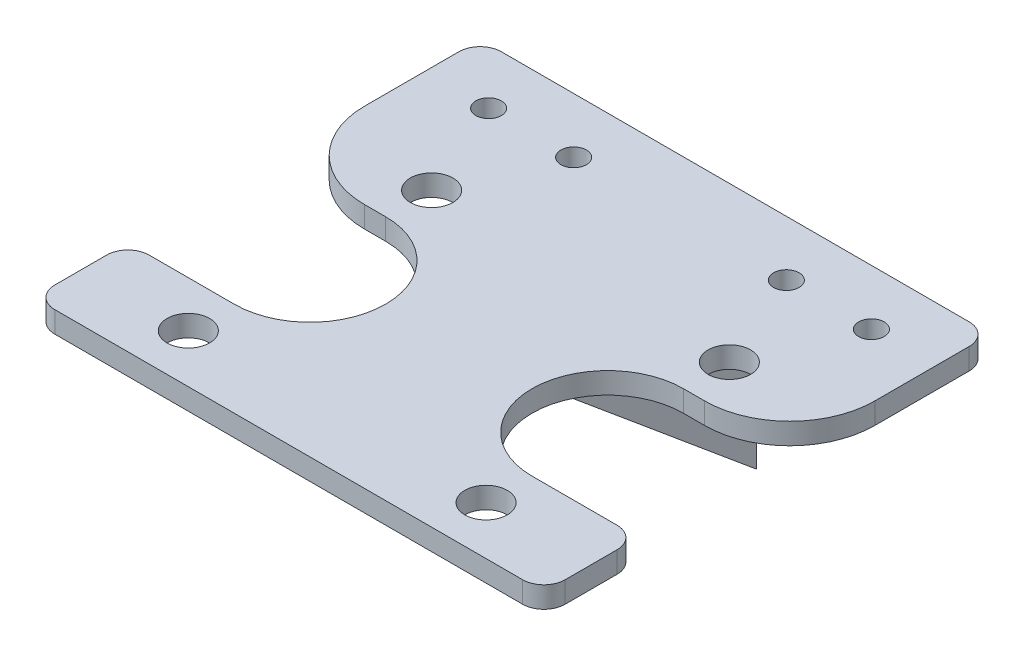
ISO-10303-21;
HEADER;
FILE_DESCRIPTION(('STEP AP214'),'2;1');
FILE_NAME('part.step','',(''),(''),'','','');
FILE_SCHEMA(('AUTOMOTIVE_DESIGN { 1 0 10303 214 1 1 1 1 }'));
ENDSEC;
DATA;
#1=APPLICATION_CONTEXT('core data for automotive mechanical design processes');
#2=APPLICATION_PROTOCOL_DEFINITION('international standard','automotive_design',2000,#1);
#3=PRODUCT_CONTEXT('',#1,'mechanical');
#4=PRODUCT('Part','Part','',(#3));
#5=PRODUCT_RELATED_PRODUCT_CATEGORY('part','',(#4));
#6=PRODUCT_DEFINITION_FORMATION('','',#4);
#7=PRODUCT_DEFINITION_CONTEXT('part definition',#1,'design');
#8=PRODUCT_DEFINITION('design','',#6,#7);
#9=PRODUCT_DEFINITION_SHAPE('','',#8);
#10=(LENGTH_UNIT() NAMED_UNIT(*) SI_UNIT(.MILLI.,.METRE.));
#11=(NAMED_UNIT(*) PLANE_ANGLE_UNIT() SI_UNIT($,.RADIAN.));
#12=(NAMED_UNIT(*) SI_UNIT($,.STERADIAN.) SOLID_ANGLE_UNIT());
#13=UNCERTAINTY_MEASURE_WITH_UNIT(LENGTH_MEASURE(1.E-05),#10,'distance_accuracy_value','');
#14=(GEOMETRIC_REPRESENTATION_CONTEXT(3) GLOBAL_UNCERTAINTY_ASSIGNED_CONTEXT((#13)) GLOBAL_UNIT_ASSIGNED_CONTEXT((#10,
#11,#12)) REPRESENTATION_CONTEXT('',''));
#15=CARTESIAN_POINT('',(0.,0.,0.));
#16=DIRECTION('',(0.,0.,1.));
#17=DIRECTION('',(1.,0.,0.));
#18=AXIS2_PLACEMENT_3D('',#15,#16,#17);
#19=CARTESIAN_POINT('',(60.,-5.,-50.));
#20=DIRECTION('',(0.,0.,-1.));
#21=DIRECTION('',(-1.,0.,0.));
#22=AXIS2_PLACEMENT_3D('',#19,#20,#21);
#23=PLANE('',#22);
#24=DIRECTION('',(-1.,0.,0.));
#25=VECTOR('',#24,1.);
#26=CARTESIAN_POINT('',(60.,0.,-50.));
#27=LINE('',#26,#25);
#28=CARTESIAN_POINT('',(55.,0.,-50.));
#29=VERTEX_POINT('',#28);
#30=CARTESIAN_POINT('',(-55.,0.,-50.));
#31=VERTEX_POINT('',#30);
#32=EDGE_CURVE('E267',#29,#31,#27,.T.);
#33=ORIENTED_EDGE('',*,*,#32,.F.);
#34=DIRECTION('',(0.,1.,0.));
#35=VECTOR('',#34,1.);
#36=CARTESIAN_POINT('',(55.,-5.,-50.));
#37=LINE('',#36,#35);
#38=CARTESIAN_POINT('',(55.,-5.,-50.));
#39=VERTEX_POINT('',#38);
#40=EDGE_CURVE('E381',#29,#39,#37,.F.);
#41=ORIENTED_EDGE('',*,*,#40,.T.);
#42=DIRECTION('',(-1.,0.,0.));
#43=VECTOR('',#42,1.);
#44=CARTESIAN_POINT('',(60.,-5.,-50.));
#45=LINE('',#44,#43);
#46=CARTESIAN_POINT('',(5.,-5.,-50.));
#47=VERTEX_POINT('',#46);
#48=EDGE_CURVE('E270',#39,#47,#45,.T.);
#49=ORIENTED_EDGE('',*,*,#48,.T.);
#50=DIRECTION('',(0.,1.,0.));
#51=VECTOR('',#50,1.);
#52=CARTESIAN_POINT('',(5.,-55.,-50.));
#53=LINE('',#52,#51);
#54=CARTESIAN_POINT('',(5.,-55.,-50.));
#55=VERTEX_POINT('',#54);
#56=EDGE_CURVE('E209',#55,#47,#53,.T.);
#57=ORIENTED_EDGE('',*,*,#56,.F.);
#58=DIRECTION('',(-1.,0.,0.));
#59=VECTOR('',#58,1.);
#60=CARTESIAN_POINT('',(5.,-55.,-50.));
#61=LINE('',#60,#59);
#62=CARTESIAN_POINT('',(-5.,-55.,-50.));
#63=VERTEX_POINT('',#62);
#64=EDGE_CURVE('E201',#55,#63,#61,.T.);
#65=ORIENTED_EDGE('',*,*,#64,.T.);
#66=DIRECTION('',(0.,1.,0.));
#67=VECTOR('',#66,1.);
#68=CARTESIAN_POINT('',(-5.,-55.,-50.));
#69=LINE('',#68,#67);
#70=CARTESIAN_POINT('',(-5.,-5.,-50.));
#71=VERTEX_POINT('',#70);
#72=EDGE_CURVE('E212',#63,#71,#69,.T.);
#73=ORIENTED_EDGE('',*,*,#72,.T.);
#74=CARTESIAN_POINT('',(-55.,-5.,-50.));
#75=VERTEX_POINT('',#74);
#76=EDGE_CURVE('E273',#71,#75,#45,.T.);
#77=ORIENTED_EDGE('',*,*,#76,.T.);
#78=DIRECTION('',(0.,1.,0.));
#79=VECTOR('',#78,1.);
#80=CARTESIAN_POINT('',(-55.,-5.,-50.));
#81=LINE('',#80,#79);
#82=EDGE_CURVE('E378',#75,#31,#81,.T.);
#83=ORIENTED_EDGE('',*,*,#82,.T.);
#84=EDGE_LOOP('',(#33,#41,#49,#57,#65,#73,#77,#83));
#85=FACE_BOUND('',#84,.T.);
#86=ADVANCED_FACE('F32',(#85),#23,.T.);
#87=CARTESIAN_POINT('',(60.,-5.,-2.8));
#88=DIRECTION('',(1.,0.,0.));
#89=DIRECTION('',(0.,0.,-1.));
#90=AXIS2_PLACEMENT_3D('',#87,#88,#89);
#91=PLANE('',#90);
#92=DIRECTION('',(0.,0.,-1.));
#93=VECTOR('',#92,1.);
#94=CARTESIAN_POINT('',(60.,-5.,-2.8));
#95=LINE('',#94,#93);
#96=CARTESIAN_POINT('',(60.,-5.,-22.8));
#97=VERTEX_POINT('',#96);
#98=CARTESIAN_POINT('',(60.,-5.,-45.));
#99=VERTEX_POINT('',#98);
#100=EDGE_CURVE('E299',#97,#99,#95,.T.);
#101=ORIENTED_EDGE('',*,*,#100,.T.);
#102=DIRECTION('',(0.,1.,0.));
#103=VECTOR('',#102,1.);
#104=CARTESIAN_POINT('',(60.,-5.,-45.));
#105=LINE('',#104,#103);
#106=CARTESIAN_POINT('',(60.,0.,-45.));
#107=VERTEX_POINT('',#106);
#108=EDGE_CURVE('E363',#99,#107,#105,.T.);
#109=ORIENTED_EDGE('',*,*,#108,.T.);
#110=DIRECTION('',(0.,0.,-1.));
#111=VECTOR('',#110,1.);
#112=CARTESIAN_POINT('',(60.,0.,-2.8));
#113=LINE('',#112,#111);
#114=CARTESIAN_POINT('',(60.,0.,-22.8));
#115=VERTEX_POINT('',#114);
#116=EDGE_CURVE('E332',#115,#107,#113,.T.);
#117=ORIENTED_EDGE('',*,*,#116,.F.);
#118=DIRECTION('',(0.,1.,0.));
#119=VECTOR('',#118,1.);
#120=CARTESIAN_POINT('',(60.,-5.,-22.8));
#121=LINE('',#120,#119);
#122=EDGE_CURVE('E351',#115,#97,#121,.F.);
#123=ORIENTED_EDGE('',*,*,#122,.T.);
#124=EDGE_LOOP('',(#101,#109,#117,#123));
#125=FACE_BOUND('',#124,.T.);
#126=ADVANCED_FACE('F480',(#125),#91,.T.);
#127=CARTESIAN_POINT('',(60.,-5.,-2.8));
#128=DIRECTION('',(0.,0.,1.));
#129=DIRECTION('',(1.,0.,0.));
#130=AXIS2_PLACEMENT_3D('',#127,#128,#129);
#131=PLANE('',#130);
#132=DIRECTION('',(1.,0.,0.));
#133=VECTOR('',#132,1.);
#134=CARTESIAN_POINT('',(60.,-5.,-2.8));
#135=LINE('',#134,#133);
#136=CARTESIAN_POINT('',(35.,-5.,-2.80000000000002));
#137=VERTEX_POINT('',#136);
#138=CARTESIAN_POINT('',(40.,-5.,-2.80000000000002));
#139=VERTEX_POINT('',#138);
#140=EDGE_CURVE('E296',#137,#139,#135,.T.);
#141=ORIENTED_EDGE('',*,*,#140,.T.);
#142=DIRECTION('',(0.,1.,0.));
#143=VECTOR('',#142,1.);
#144=CARTESIAN_POINT('',(40.,-5.,-2.80000000000002));
#145=LINE('',#144,#143);
#146=CARTESIAN_POINT('',(40.,0.,-2.80000000000002));
#147=VERTEX_POINT('',#146);
#148=EDGE_CURVE('E337',#139,#147,#145,.T.);
#149=ORIENTED_EDGE('',*,*,#148,.T.);
#150=DIRECTION('',(1.,0.,0.));
#151=VECTOR('',#150,1.);
#152=CARTESIAN_POINT('',(60.,0.,-2.8));
#153=LINE('',#152,#151);
#154=CARTESIAN_POINT('',(35.,0.,-2.80000000000002));
#155=VERTEX_POINT('',#154);
#156=EDGE_CURVE('E329',#155,#147,#153,.T.);
#157=ORIENTED_EDGE('',*,*,#156,.F.);
#158=DIRECTION('',(0.,1.,0.));
#159=VECTOR('',#158,1.);
#160=CARTESIAN_POINT('',(35.,-5.,-2.80000000000002));
#161=LINE('',#160,#159);
#162=EDGE_CURVE('E335',#137,#155,#161,.T.);
#163=ORIENTED_EDGE('',*,*,#162,.F.);
#164=EDGE_LOOP('',(#141,#149,#157,#163));
#165=FACE_BOUND('',#164,.T.);
#166=ADVANCED_FACE('F489',(#165),#131,.T.);
#167=CARTESIAN_POINT('',(35.,-5.,15.));
#168=DIRECTION('',(0.,1.,0.));
#169=DIRECTION('',(0.,0.,1.));
#170=AXIS2_PLACEMENT_3D('',#167,#168,#169);
#171=CYLINDRICAL_SURFACE('',#170,17.8);
#172=CARTESIAN_POINT('',(35.,0.,15.));
#173=DIRECTION('',(0.,-1.,0.));
#174=DIRECTION('',(0.,0.,1.));
#175=AXIS2_PLACEMENT_3D('',#172,#173,#174);
#176=CIRCLE('',#175,17.8);
#177=CARTESIAN_POINT('',(35.,0.,32.8));
#178=VERTEX_POINT('',#177);
#179=EDGE_CURVE('E326',#178,#155,#176,.T.);
#180=ORIENTED_EDGE('',*,*,#179,.F.);
#181=DIRECTION('',(0.,1.,0.));
#182=VECTOR('',#181,1.);
#183=CARTESIAN_POINT('',(35.,-5.,32.8));
#184=LINE('',#183,#182);
#185=CARTESIAN_POINT('',(35.,-5.,32.8));
#186=VERTEX_POINT('',#185);
#187=EDGE_CURVE('E338',#186,#178,#184,.T.);
#188=ORIENTED_EDGE('',*,*,#187,.F.);
#189=CARTESIAN_POINT('',(35.,-5.,15.));
#190=DIRECTION('',(0.,-1.,0.));
#191=DIRECTION('',(0.,0.,1.));
#192=AXIS2_PLACEMENT_3D('',#189,#190,#191);
#193=CIRCLE('',#192,17.8);
#194=EDGE_CURVE('E293',#186,#137,#193,.T.);
#195=ORIENTED_EDGE('',*,*,#194,.T.);
#196=ORIENTED_EDGE('',*,*,#162,.T.);
#197=EDGE_LOOP('',(#180,#188,#195,#196));
#198=FACE_BOUND('',#197,.T.);
#199=ADVANCED_FACE('F492',(#198),#171,.F.);
#200=CARTESIAN_POINT('',(60.,-5.,32.8));
#201=DIRECTION('',(0.,0.,-1.));
#202=DIRECTION('',(-1.,0.,0.));
#203=AXIS2_PLACEMENT_3D('',#200,#201,#202);
#204=PLANE('',#203);
#205=DIRECTION('',(-1.,0.,0.));
#206=VECTOR('',#205,1.);
#207=CARTESIAN_POINT('',(60.,0.,32.8));
#208=LINE('',#207,#206);
#209=CARTESIAN_POINT('',(55.,0.,32.8));
#210=VERTEX_POINT('',#209);
#211=EDGE_CURVE('E324',#210,#178,#208,.T.);
#212=ORIENTED_EDGE('',*,*,#211,.F.);
#213=DIRECTION('',(0.,1.,0.));
#214=VECTOR('',#213,1.);
#215=CARTESIAN_POINT('',(55.,-5.,32.8));
#216=LINE('',#215,#214);
#217=CARTESIAN_POINT('',(55.,-5.,32.8));
#218=VERTEX_POINT('',#217);
#219=EDGE_CURVE('E40',#210,#218,#216,.F.);
#220=ORIENTED_EDGE('',*,*,#219,.T.);
#221=DIRECTION('',(-1.,0.,0.));
#222=VECTOR('',#221,1.);
#223=CARTESIAN_POINT('',(60.,-5.,32.8));
#224=LINE('',#223,#222);
#225=EDGE_CURVE('E291',#218,#186,#224,.T.);
#226=ORIENTED_EDGE('',*,*,#225,.T.);
#227=ORIENTED_EDGE('',*,*,#187,.T.);
#228=EDGE_LOOP('',(#212,#220,#226,#227));
#229=FACE_BOUND('',#228,.T.);
#230=ADVANCED_FACE('F413',(#229),#204,.T.);
#231=CARTESIAN_POINT('',(60.,-5.,55.));
#232=DIRECTION('',(1.,0.,0.));
#233=DIRECTION('',(0.,0.,-1.));
#234=AXIS2_PLACEMENT_3D('',#231,#232,#233);
#235=PLANE('',#234);
#236=DIRECTION('',(0.,0.,-1.));
#237=VECTOR('',#236,1.);
#238=CARTESIAN_POINT('',(60.,0.,55.));
#239=LINE('',#238,#237);
#240=CARTESIAN_POINT('',(60.,0.,50.));
#241=VERTEX_POINT('',#240);
#242=CARTESIAN_POINT('',(60.,0.,37.8));
#243=VERTEX_POINT('',#242);
#244=EDGE_CURVE('E321',#241,#243,#239,.T.);
#245=ORIENTED_EDGE('',*,*,#244,.F.);
#246=DIRECTION('',(0.,1.,0.));
#247=VECTOR('',#246,1.);
#248=CARTESIAN_POINT('',(60.,-5.,50.));
#249=LINE('',#248,#247);
#250=CARTESIAN_POINT('',(60.,-5.,50.));
#251=VERTEX_POINT('',#250);
#252=EDGE_CURVE('E408',#241,#251,#249,.F.);
#253=ORIENTED_EDGE('',*,*,#252,.T.);
#254=DIRECTION('',(0.,0.,-1.));
#255=VECTOR('',#254,1.);
#256=CARTESIAN_POINT('',(60.,-5.,55.));
#257=LINE('',#256,#255);
#258=CARTESIAN_POINT('',(60.,-5.,37.8));
#259=VERTEX_POINT('',#258);
#260=EDGE_CURVE('E288',#251,#259,#257,.T.);
#261=ORIENTED_EDGE('',*,*,#260,.T.);
#262=DIRECTION('',(0.,1.,0.));
#263=VECTOR('',#262,1.);
#264=CARTESIAN_POINT('',(60.,-5.,37.8));
#265=LINE('',#264,#263);
#266=EDGE_CURVE('E405',#259,#243,#265,.T.);
#267=ORIENTED_EDGE('',*,*,#266,.T.);
#268=EDGE_LOOP('',(#245,#253,#261,#267));
#269=FACE_BOUND('',#268,.T.);
#270=ADVANCED_FACE('F424',(#269),#235,.T.);
#271=CARTESIAN_POINT('',(-60.,-5.,55.));
#272=DIRECTION('',(0.,0.,1.));
#273=DIRECTION('',(1.,0.,0.));
#274=AXIS2_PLACEMENT_3D('',#271,#272,#273);
#275=PLANE('',#274);
#276=DIRECTION('',(1.,0.,0.));
#277=VECTOR('',#276,1.);
#278=CARTESIAN_POINT('',(-60.,0.,55.));
#279=LINE('',#278,#277);
#280=CARTESIAN_POINT('',(-55.,0.,55.));
#281=VERTEX_POINT('',#280);
#282=CARTESIAN_POINT('',(55.,0.,55.));
#283=VERTEX_POINT('',#282);
#284=EDGE_CURVE('E318',#281,#283,#279,.T.);
#285=ORIENTED_EDGE('',*,*,#284,.F.);
#286=DIRECTION('',(0.,1.,0.));
#287=VECTOR('',#286,1.);
#288=CARTESIAN_POINT('',(-55.,-5.,55.));
#289=LINE('',#288,#287);
#290=CARTESIAN_POINT('',(-55.,-5.,55.));
#291=VERTEX_POINT('',#290);
#292=EDGE_CURVE('E403',#281,#291,#289,.F.);
#293=ORIENTED_EDGE('',*,*,#292,.T.);
#294=DIRECTION('',(1.,0.,0.));
#295=VECTOR('',#294,1.);
#296=CARTESIAN_POINT('',(-60.,-5.,55.));
#297=LINE('',#296,#295);
#298=CARTESIAN_POINT('',(55.,-5.,55.));
#299=VERTEX_POINT('',#298);
#300=EDGE_CURVE('E285',#291,#299,#297,.T.);
#301=ORIENTED_EDGE('',*,*,#300,.T.);
#302=DIRECTION('',(0.,1.,0.));
#303=VECTOR('',#302,1.);
#304=CARTESIAN_POINT('',(55.,-5.,55.));
#305=LINE('',#304,#303);
#306=EDGE_CURVE('E400',#299,#283,#305,.T.);
#307=ORIENTED_EDGE('',*,*,#306,.T.);
#308=EDGE_LOOP('',(#285,#293,#301,#307));
#309=FACE_BOUND('',#308,.T.);
#310=ADVANCED_FACE('F434',(#309),#275,.T.);
#311=CARTESIAN_POINT('',(-60.,-5.,32.8));
#312=DIRECTION('',(-1.,0.,0.));
#313=DIRECTION('',(0.,0.,1.));
#314=AXIS2_PLACEMENT_3D('',#311,#312,#313);
#315=PLANE('',#314);
#316=DIRECTION('',(0.,0.,1.));
#317=VECTOR('',#316,1.);
#318=CARTESIAN_POINT('',(-60.,-5.,32.8));
#319=LINE('',#318,#317);
#320=CARTESIAN_POINT('',(-60.,-5.,37.8));
#321=VERTEX_POINT('',#320);
#322=CARTESIAN_POINT('',(-60.,-5.,50.));
#323=VERTEX_POINT('',#322);
#324=EDGE_CURVE('E282',#321,#323,#319,.T.);
#325=ORIENTED_EDGE('',*,*,#324,.T.);
#326=DIRECTION('',(0.,1.,0.));
#327=VECTOR('',#326,1.);
#328=CARTESIAN_POINT('',(-60.,-5.,50.));
#329=LINE('',#328,#327);
#330=CARTESIAN_POINT('',(-60.,0.,50.));
#331=VERTEX_POINT('',#330);
#332=EDGE_CURVE('E397',#323,#331,#329,.T.);
#333=ORIENTED_EDGE('',*,*,#332,.T.);
#334=DIRECTION('',(0.,0.,1.));
#335=VECTOR('',#334,1.);
#336=CARTESIAN_POINT('',(-60.,0.,32.8));
#337=LINE('',#336,#335);
#338=CARTESIAN_POINT('',(-60.,0.,37.8));
#339=VERTEX_POINT('',#338);
#340=EDGE_CURVE('E315',#339,#331,#337,.T.);
#341=ORIENTED_EDGE('',*,*,#340,.F.);
#342=DIRECTION('',(0.,1.,0.));
#343=VECTOR('',#342,1.);
#344=CARTESIAN_POINT('',(-60.,-5.,37.8));
#345=LINE('',#344,#343);
#346=EDGE_CURVE('E395',#339,#321,#345,.F.);
#347=ORIENTED_EDGE('',*,*,#346,.T.);
#348=EDGE_LOOP('',(#325,#333,#341,#347));
#349=FACE_BOUND('',#348,.T.);
#350=ADVANCED_FACE('F443',(#349),#315,.T.);
#351=CARTESIAN_POINT('',(-35.,-5.,32.8));
#352=DIRECTION('',(0.,0.,-1.));
#353=DIRECTION('',(-1.,0.,0.));
#354=AXIS2_PLACEMENT_3D('',#351,#352,#353);
#355=PLANE('',#354);
#356=DIRECTION('',(-1.,0.,0.));
#357=VECTOR('',#356,1.);
#358=CARTESIAN_POINT('',(-35.,-5.,32.8));
#359=LINE('',#358,#357);
#360=CARTESIAN_POINT('',(-35.,-5.,32.8));
#361=VERTEX_POINT('',#360);
#362=CARTESIAN_POINT('',(-55.,-5.,32.8));
#363=VERTEX_POINT('',#362);
#364=EDGE_CURVE('E280',#361,#363,#359,.T.);
#365=ORIENTED_EDGE('',*,*,#364,.T.);
#366=DIRECTION('',(0.,1.,0.));
#367=VECTOR('',#366,1.);
#368=CARTESIAN_POINT('',(-55.,-5.,32.8));
#369=LINE('',#368,#367);
#370=CARTESIAN_POINT('',(-55.,0.,32.8));
#371=VERTEX_POINT('',#370);
#372=EDGE_CURVE('E11',#363,#371,#369,.T.);
#373=ORIENTED_EDGE('',*,*,#372,.T.);
#374=DIRECTION('',(-1.,0.,0.));
#375=VECTOR('',#374,1.);
#376=CARTESIAN_POINT('',(-35.,0.,32.8));
#377=LINE('',#376,#375);
#378=CARTESIAN_POINT('',(-35.,0.,32.8));
#379=VERTEX_POINT('',#378);
#380=EDGE_CURVE('E312',#379,#371,#377,.T.);
#381=ORIENTED_EDGE('',*,*,#380,.F.);
#382=DIRECTION('',(0.,1.,0.));
#383=VECTOR('',#382,1.);
#384=CARTESIAN_POINT('',(-35.,-5.,32.8));
#385=LINE('',#384,#383);
#386=EDGE_CURVE('E341',#361,#379,#385,.T.);
#387=ORIENTED_EDGE('',*,*,#386,.F.);
#388=EDGE_LOOP('',(#365,#373,#381,#387));
#389=FACE_BOUND('',#388,.T.);
#390=ADVANCED_FACE('F449',(#389),#355,.T.);
#391=CARTESIAN_POINT('',(-35.,-5.,15.));
#392=DIRECTION('',(0.,1.,0.));
#393=DIRECTION('',(0.,0.,1.));
#394=AXIS2_PLACEMENT_3D('',#391,#392,#393);
#395=CYLINDRICAL_SURFACE('',#394,17.8);
#396=CARTESIAN_POINT('',(-35.,0.,15.));
#397=DIRECTION('',(0.,-1.,0.));
#398=DIRECTION('',(0.,0.,1.));
#399=AXIS2_PLACEMENT_3D('',#396,#397,#398);
#400=CIRCLE('',#399,17.8);
#401=CARTESIAN_POINT('',(-35.,0.,-2.80000000000002));
#402=VERTEX_POINT('',#401);
#403=EDGE_CURVE('E309',#402,#379,#400,.T.);
#404=ORIENTED_EDGE('',*,*,#403,.F.);
#405=DIRECTION('',(0.,1.,0.));
#406=VECTOR('',#405,1.);
#407=CARTESIAN_POINT('',(-35.,-5.,-2.80000000000002));
#408=LINE('',#407,#406);
#409=CARTESIAN_POINT('',(-35.,-5.,-2.80000000000002));
#410=VERTEX_POINT('',#409);
#411=EDGE_CURVE('E302',#410,#402,#408,.T.);
#412=ORIENTED_EDGE('',*,*,#411,.F.);
#413=CARTESIAN_POINT('',(-35.,-5.,15.));
#414=DIRECTION('',(0.,-1.,0.));
#415=DIRECTION('',(0.,0.,1.));
#416=AXIS2_PLACEMENT_3D('',#413,#414,#415);
#417=CIRCLE('',#416,17.8);
#418=EDGE_CURVE('E277',#410,#361,#417,.T.);
#419=ORIENTED_EDGE('',*,*,#418,.T.);
#420=ORIENTED_EDGE('',*,*,#386,.T.);
#421=EDGE_LOOP('',(#404,#412,#419,#420));
#422=FACE_BOUND('',#421,.T.);
#423=ADVANCED_FACE('F455',(#422),#395,.F.);
#424=CARTESIAN_POINT('',(-35.,-5.,-2.80000000000002));
#425=DIRECTION('',(0.,0.,1.));
#426=DIRECTION('',(1.,0.,0.));
#427=AXIS2_PLACEMENT_3D('',#424,#425,#426);
#428=PLANE('',#427);
#429=DIRECTION('',(1.,0.,0.));
#430=VECTOR('',#429,1.);
#431=CARTESIAN_POINT('',(-35.,0.,-2.80000000000002));
#432=LINE('',#431,#430);
#433=CARTESIAN_POINT('',(-40.,0.,-2.80000000000001));
#434=VERTEX_POINT('',#433);
#435=EDGE_CURVE('E307',#434,#402,#432,.T.);
#436=ORIENTED_EDGE('',*,*,#435,.F.);
#437=DIRECTION('',(0.,1.,0.));
#438=VECTOR('',#437,1.);
#439=CARTESIAN_POINT('',(-40.,-5.,-2.80000000000001));
#440=LINE('',#439,#438);
#441=CARTESIAN_POINT('',(-40.,-5.,-2.80000000000001));
#442=VERTEX_POINT('',#441);
#443=EDGE_CURVE('E361',#434,#442,#440,.F.);
#444=ORIENTED_EDGE('',*,*,#443,.T.);
#445=DIRECTION('',(1.,0.,0.));
#446=VECTOR('',#445,1.);
#447=CARTESIAN_POINT('',(-35.,-5.,-2.80000000000002));
#448=LINE('',#447,#446);
#449=EDGE_CURVE('E275',#442,#410,#448,.T.);
#450=ORIENTED_EDGE('',*,*,#449,.T.);
#451=ORIENTED_EDGE('',*,*,#411,.T.);
#452=EDGE_LOOP('',(#436,#444,#450,#451));
#453=FACE_BOUND('',#452,.T.);
#454=ADVANCED_FACE('F458',(#453),#428,.T.);
#455=CARTESIAN_POINT('',(-60.,-5.,-50.));
#456=DIRECTION('',(-1.,0.,0.));
#457=DIRECTION('',(0.,0.,1.));
#458=AXIS2_PLACEMENT_3D('',#455,#456,#457);
#459=PLANE('',#458);
#460=DIRECTION('',(0.,0.,1.));
#461=VECTOR('',#460,1.);
#462=CARTESIAN_POINT('',(-60.,0.,-50.));
#463=LINE('',#462,#461);
#464=CARTESIAN_POINT('',(-60.,0.,-45.));
#465=VERTEX_POINT('',#464);
#466=CARTESIAN_POINT('',(-60.,0.,-22.8));
#467=VERTEX_POINT('',#466);
#468=EDGE_CURVE('E305',#465,#467,#463,.T.);
#469=ORIENTED_EDGE('',*,*,#468,.F.);
#470=DIRECTION('',(0.,1.,0.));
#471=VECTOR('',#470,1.);
#472=CARTESIAN_POINT('',(-60.,-5.,-45.));
#473=LINE('',#472,#471);
#474=CARTESIAN_POINT('',(-60.,-5.,-45.));
#475=VERTEX_POINT('',#474);
#476=EDGE_CURVE('E47',#465,#475,#473,.F.);
#477=ORIENTED_EDGE('',*,*,#476,.T.);
#478=DIRECTION('',(0.,0.,1.));
#479=VECTOR('',#478,1.);
#480=CARTESIAN_POINT('',(-60.,-5.,-50.));
#481=LINE('',#480,#479);
#482=CARTESIAN_POINT('',(-60.,-5.,-22.8));
#483=VERTEX_POINT('',#482);
#484=EDGE_CURVE('E272',#475,#483,#481,.T.);
#485=ORIENTED_EDGE('',*,*,#484,.T.);
#486=DIRECTION('',(0.,1.,0.));
#487=VECTOR('',#486,1.);
#488=CARTESIAN_POINT('',(-60.,-5.,-22.8));
#489=LINE('',#488,#487);
#490=EDGE_CURVE('E358',#483,#467,#489,.T.);
#491=ORIENTED_EDGE('',*,*,#490,.T.);
#492=EDGE_LOOP('',(#469,#477,#485,#491));
#493=FACE_BOUND('',#492,.T.);
#494=ADVANCED_FACE('F465',(#493),#459,.T.);
#495=CARTESIAN_POINT('',(-35.,-5.,15.));
#496=DIRECTION('',(0.,1.,0.));
#497=DIRECTION('',(0.,0.,1.));
#498=AXIS2_PLACEMENT_3D('',#495,#496,#497);
#499=PLANE('',#498);
#500=CARTESIAN_POINT('',(45.,-5.,-37.));
#501=DIRECTION('',(0.,1.,0.));
#502=DIRECTION('',(0.,0.,1.));
#503=AXIS2_PLACEMENT_3D('',#500,#501,#502);
#504=CIRCLE('',#503,3.);
#505=CARTESIAN_POINT('',(45.,-5.,-34.));
#506=VERTEX_POINT('',#505);
#507=EDGE_CURVE('E222',#506,#506,#504,.T.);
#508=ORIENTED_EDGE('',*,*,#507,.T.);
#509=EDGE_LOOP('',(#508));
#510=FACE_BOUND('',#509,.T.);
#511=CARTESIAN_POINT('',(25.,-5.,-37.));
#512=DIRECTION('',(0.,1.,0.));
#513=DIRECTION('',(0.,0.,1.));
#514=AXIS2_PLACEMENT_3D('',#511,#512,#513);
#515=CIRCLE('',#514,3.);
#516=CARTESIAN_POINT('',(25.,-5.,-34.));
#517=VERTEX_POINT('',#516);
#518=EDGE_CURVE('E228',#517,#517,#515,.T.);
#519=ORIENTED_EDGE('',*,*,#518,.T.);
#520=EDGE_LOOP('',(#519));
#521=FACE_BOUND('',#520,.T.);
#522=CARTESIAN_POINT('',(-25.,-5.,-37.));
#523=DIRECTION('',(0.,1.,0.));
#524=DIRECTION('',(0.,0.,1.));
#525=AXIS2_PLACEMENT_3D('',#522,#523,#524);
#526=CIRCLE('',#525,3.);
#527=CARTESIAN_POINT('',(-25.,-5.,-34.));
#528=VERTEX_POINT('',#527);
#529=EDGE_CURVE('E234',#528,#528,#526,.T.);
#530=ORIENTED_EDGE('',*,*,#529,.T.);
#531=EDGE_LOOP('',(#530));
#532=FACE_BOUND('',#531,.T.);
#533=CARTESIAN_POINT('',(35.,-5.,43.6));
#534=DIRECTION('',(0.,1.,0.));
#535=DIRECTION('',(0.,0.,1.));
#536=AXIS2_PLACEMENT_3D('',#533,#534,#535);
#537=CIRCLE('',#536,5.);
#538=CARTESIAN_POINT('',(35.,-5.,48.6));
#539=VERTEX_POINT('',#538);
#540=EDGE_CURVE('E240',#539,#539,#537,.T.);
#541=ORIENTED_EDGE('',*,*,#540,.T.);
#542=EDGE_LOOP('',(#541));
#543=FACE_BOUND('',#542,.T.);
#544=CARTESIAN_POINT('',(35.,-5.,-13.6));
#545=DIRECTION('',(0.,1.,0.));
#546=DIRECTION('',(0.,0.,1.));
#547=AXIS2_PLACEMENT_3D('',#544,#545,#546);
#548=CIRCLE('',#547,5.);
#549=CARTESIAN_POINT('',(35.,-5.,-8.60000000000003));
#550=VERTEX_POINT('',#549);
#551=EDGE_CURVE('E246',#550,#550,#548,.T.);
#552=ORIENTED_EDGE('',*,*,#551,.T.);
#553=EDGE_LOOP('',(#552));
#554=FACE_BOUND('',#553,.T.);
#555=CARTESIAN_POINT('',(-35.,-5.,43.6));
#556=DIRECTION('',(0.,1.,0.));
#557=DIRECTION('',(0.,0.,1.));
#558=AXIS2_PLACEMENT_3D('',#555,#556,#557);
#559=CIRCLE('',#558,5.);
#560=CARTESIAN_POINT('',(-35.,-5.,48.6));
#561=VERTEX_POINT('',#560);
#562=EDGE_CURVE('E252',#561,#561,#559,.T.);
#563=ORIENTED_EDGE('',*,*,#562,.T.);
#564=EDGE_LOOP('',(#563));
#565=FACE_BOUND('',#564,.T.);
#566=CARTESIAN_POINT('',(-35.,-5.,-13.6));
#567=DIRECTION('',(0.,1.,0.));
#568=DIRECTION('',(0.,0.,1.));
#569=AXIS2_PLACEMENT_3D('',#566,#567,#568);
#570=CIRCLE('',#569,5.);
#571=CARTESIAN_POINT('',(-35.,-5.,-8.60000000000003));
#572=VERTEX_POINT('',#571);
#573=EDGE_CURVE('E258',#572,#572,#570,.T.);
#574=ORIENTED_EDGE('',*,*,#573,.T.);
#575=EDGE_LOOP('',(#574));
#576=FACE_BOUND('',#575,.T.);
#577=CARTESIAN_POINT('',(-45.,-5.,-37.));
#578=DIRECTION('',(0.,1.,0.));
#579=DIRECTION('',(0.,0.,1.));
#580=AXIS2_PLACEMENT_3D('',#577,#578,#579);
#581=CIRCLE('',#580,3.);
#582=CARTESIAN_POINT('',(-45.,-5.,-34.));
#583=VERTEX_POINT('',#582);
#584=EDGE_CURVE('E264',#583,#583,#581,.T.);
#585=ORIENTED_EDGE('',*,*,#584,.T.);
#586=EDGE_LOOP('',(#585));
#587=FACE_BOUND('',#586,.T.);
#588=ORIENTED_EDGE('',*,*,#48,.F.);
#589=CARTESIAN_POINT('',(55.,-5.,-45.));
#590=DIRECTION('',(0.,1.,0.));
#591=DIRECTION('',(0.,0.,1.));
#592=AXIS2_PLACEMENT_3D('',#589,#590,#591);
#593=CIRCLE('',#592,5.);
#594=EDGE_CURVE('E392',#39,#99,#593,.F.);
#595=ORIENTED_EDGE('',*,*,#594,.T.);
#596=ORIENTED_EDGE('',*,*,#100,.F.);
#597=CARTESIAN_POINT('',(40.,-5.,-22.8));
#598=DIRECTION('',(0.,1.,0.));
#599=DIRECTION('',(0.,0.,1.));
#600=AXIS2_PLACEMENT_3D('',#597,#598,#599);
#601=CIRCLE('',#600,20.);
#602=EDGE_CURVE('E356',#97,#139,#601,.F.);
#603=ORIENTED_EDGE('',*,*,#602,.T.);
#604=ORIENTED_EDGE('',*,*,#140,.F.);
#605=ORIENTED_EDGE('',*,*,#194,.F.);
#606=ORIENTED_EDGE('',*,*,#225,.F.);
#607=CARTESIAN_POINT('',(55.,-5.,37.8));
#608=DIRECTION('',(0.,1.,0.));
#609=DIRECTION('',(0.,0.,1.));
#610=AXIS2_PLACEMENT_3D('',#607,#608,#609);
#611=CIRCLE('',#610,5.);
#612=EDGE_CURVE('E384',#218,#259,#611,.F.);
#613=ORIENTED_EDGE('',*,*,#612,.T.);
#614=ORIENTED_EDGE('',*,*,#260,.F.);
#615=CARTESIAN_POINT('',(55.,-5.,50.));
#616=DIRECTION('',(0.,1.,0.));
#617=DIRECTION('',(0.,0.,1.));
#618=AXIS2_PLACEMENT_3D('',#615,#616,#617);
#619=CIRCLE('',#618,5.);
#620=EDGE_CURVE('E386',#251,#299,#619,.F.);
#621=ORIENTED_EDGE('',*,*,#620,.T.);
#622=ORIENTED_EDGE('',*,*,#300,.F.);
#623=CARTESIAN_POINT('',(-55.,-5.,50.));
#624=DIRECTION('',(0.,1.,0.));
#625=DIRECTION('',(0.,0.,1.));
#626=AXIS2_PLACEMENT_3D('',#623,#624,#625);
#627=CIRCLE('',#626,5.);
#628=EDGE_CURVE('E388',#291,#323,#627,.F.);
#629=ORIENTED_EDGE('',*,*,#628,.T.);
#630=ORIENTED_EDGE('',*,*,#324,.F.);
#631=CARTESIAN_POINT('',(-55.,-5.,37.8));
#632=DIRECTION('',(0.,1.,0.));
#633=DIRECTION('',(0.,0.,1.));
#634=AXIS2_PLACEMENT_3D('',#631,#632,#633);
#635=CIRCLE('',#634,5.);
#636=EDGE_CURVE('E55',#321,#363,#635,.F.);
#637=ORIENTED_EDGE('',*,*,#636,.T.);
#638=ORIENTED_EDGE('',*,*,#364,.F.);
#639=ORIENTED_EDGE('',*,*,#418,.F.);
#640=ORIENTED_EDGE('',*,*,#449,.F.);
#641=CARTESIAN_POINT('',(-40.,-5.,-22.8));
#642=DIRECTION('',(0.,1.,0.));
#643=DIRECTION('',(0.,0.,1.));
#644=AXIS2_PLACEMENT_3D('',#641,#642,#643);
#645=CIRCLE('',#644,20.);
#646=EDGE_CURVE('E353',#442,#483,#645,.F.);
#647=ORIENTED_EDGE('',*,*,#646,.T.);
#648=ORIENTED_EDGE('',*,*,#484,.F.);
#649=CARTESIAN_POINT('',(-55.,-5.,-45.));
#650=DIRECTION('',(0.,1.,0.));
#651=DIRECTION('',(0.,0.,1.));
#652=AXIS2_PLACEMENT_3D('',#649,#650,#651);
#653=CIRCLE('',#652,5.);
#654=EDGE_CURVE('E390',#475,#75,#653,.F.);
#655=ORIENTED_EDGE('',*,*,#654,.T.);
#656=ORIENTED_EDGE('',*,*,#76,.F.);
#657=DIRECTION('',(0.,0.,1.));
#658=VECTOR('',#657,1.);
#659=CARTESIAN_POINT('',(-5.,-5.,-50.));
#660=LINE('',#659,#658);
#661=CARTESIAN_POINT('',(-5.,-5.,9.99999999999999));
#662=VERTEX_POINT('',#661);
#663=EDGE_CURVE('E197',#71,#662,#660,.T.);
#664=ORIENTED_EDGE('',*,*,#663,.T.);
#665=DIRECTION('',(-1.,0.,0.));
#666=VECTOR('',#665,1.);
#667=CARTESIAN_POINT('',(5.,-5.,9.99999999999999));
#668=LINE('',#667,#666);
#669=CARTESIAN_POINT('',(5.,-5.,9.99999999999999));
#670=VERTEX_POINT('',#669);
#671=EDGE_CURVE('E189',#670,#662,#668,.T.);
#672=ORIENTED_EDGE('',*,*,#671,.F.);
#673=DIRECTION('',(0.,0.,1.));
#674=VECTOR('',#673,1.);
#675=CARTESIAN_POINT('',(5.,-5.,-50.));
#676=LINE('',#675,#674);
#677=EDGE_CURVE('E194',#47,#670,#676,.T.);
#678=ORIENTED_EDGE('',*,*,#677,.F.);
#679=EDGE_LOOP('',(#588,#595,#596,#603,#604,#605,#606,#613,#614,#621,#622,#629,#630,#637,#638,
#639,#640,#647,#648,#655,#656,#664,#672,#678));
#680=FACE_BOUND('',#679,.T.);
#681=ADVANCED_FACE('F192',(#510,#521,#532,#543,#554,#565,#576,#587,#680),#499,.F.);
#682=CARTESIAN_POINT('',(-35.,0.,15.));
#683=DIRECTION('',(0.,1.,0.));
#684=DIRECTION('',(0.,0.,1.));
#685=AXIS2_PLACEMENT_3D('',#682,#683,#684);
#686=PLANE('',#685);
#687=CARTESIAN_POINT('',(45.,0.,-37.));
#688=DIRECTION('',(0.,1.,0.));
#689=DIRECTION('',(0.,0.,1.));
#690=AXIS2_PLACEMENT_3D('',#687,#688,#689);
#691=CIRCLE('',#690,3.);
#692=CARTESIAN_POINT('',(45.,0.,-34.));
#693=VERTEX_POINT('',#692);
#694=EDGE_CURVE('E200',#693,#693,#691,.T.);
#695=ORIENTED_EDGE('',*,*,#694,.F.);
#696=EDGE_LOOP('',(#695));
#697=FACE_BOUND('',#696,.T.);
#698=CARTESIAN_POINT('',(25.,0.,-37.));
#699=DIRECTION('',(0.,1.,0.));
#700=DIRECTION('',(0.,0.,1.));
#701=AXIS2_PLACEMENT_3D('',#698,#699,#700);
#702=CIRCLE('',#701,3.);
#703=CARTESIAN_POINT('',(25.,0.,-34.));
#704=VERTEX_POINT('',#703);
#705=EDGE_CURVE('E225',#704,#704,#702,.T.);
#706=ORIENTED_EDGE('',*,*,#705,.F.);
#707=EDGE_LOOP('',(#706));
#708=FACE_BOUND('',#707,.T.);
#709=CARTESIAN_POINT('',(-25.,0.,-37.));
#710=DIRECTION('',(0.,1.,0.));
#711=DIRECTION('',(0.,0.,1.));
#712=AXIS2_PLACEMENT_3D('',#709,#710,#711);
#713=CIRCLE('',#712,3.);
#714=CARTESIAN_POINT('',(-25.,0.,-34.));
#715=VERTEX_POINT('',#714);
#716=EDGE_CURVE('E231',#715,#715,#713,.T.);
#717=ORIENTED_EDGE('',*,*,#716,.F.);
#718=EDGE_LOOP('',(#717));
#719=FACE_BOUND('',#718,.T.);
#720=CARTESIAN_POINT('',(35.,0.,43.6));
#721=DIRECTION('',(0.,1.,0.));
#722=DIRECTION('',(0.,0.,1.));
#723=AXIS2_PLACEMENT_3D('',#720,#721,#722);
#724=CIRCLE('',#723,5.);
#725=CARTESIAN_POINT('',(35.,0.,48.6));
#726=VERTEX_POINT('',#725);
#727=EDGE_CURVE('E237',#726,#726,#724,.T.);
#728=ORIENTED_EDGE('',*,*,#727,.F.);
#729=EDGE_LOOP('',(#728));
#730=FACE_BOUND('',#729,.T.);
#731=CARTESIAN_POINT('',(35.,0.,-13.6));
#732=DIRECTION('',(0.,1.,0.));
#733=DIRECTION('',(0.,0.,1.));
#734=AXIS2_PLACEMENT_3D('',#731,#732,#733);
#735=CIRCLE('',#734,5.);
#736=CARTESIAN_POINT('',(35.,0.,-8.60000000000003));
#737=VERTEX_POINT('',#736);
#738=EDGE_CURVE('E243',#737,#737,#735,.T.);
#739=ORIENTED_EDGE('',*,*,#738,.F.);
#740=EDGE_LOOP('',(#739));
#741=FACE_BOUND('',#740,.T.);
#742=CARTESIAN_POINT('',(-35.,0.,43.6));
#743=DIRECTION('',(0.,1.,0.));
#744=DIRECTION('',(0.,0.,1.));
#745=AXIS2_PLACEMENT_3D('',#742,#743,#744);
#746=CIRCLE('',#745,5.);
#747=CARTESIAN_POINT('',(-35.,0.,48.6));
#748=VERTEX_POINT('',#747);
#749=EDGE_CURVE('E249',#748,#748,#746,.T.);
#750=ORIENTED_EDGE('',*,*,#749,.F.);
#751=EDGE_LOOP('',(#750));
#752=FACE_BOUND('',#751,.T.);
#753=CARTESIAN_POINT('',(-35.,0.,-13.6));
#754=DIRECTION('',(0.,1.,0.));
#755=DIRECTION('',(0.,0.,1.));
#756=AXIS2_PLACEMENT_3D('',#753,#754,#755);
#757=CIRCLE('',#756,5.);
#758=CARTESIAN_POINT('',(-35.,0.,-8.60000000000003));
#759=VERTEX_POINT('',#758);
#760=EDGE_CURVE('E255',#759,#759,#757,.T.);
#761=ORIENTED_EDGE('',*,*,#760,.F.);
#762=EDGE_LOOP('',(#761));
#763=FACE_BOUND('',#762,.T.);
#764=CARTESIAN_POINT('',(-45.,0.,-37.));
#765=DIRECTION('',(0.,1.,0.));
#766=DIRECTION('',(0.,0.,1.));
#767=AXIS2_PLACEMENT_3D('',#764,#765,#766);
#768=CIRCLE('',#767,3.);
#769=CARTESIAN_POINT('',(-45.,0.,-34.));
#770=VERTEX_POINT('',#769);
#771=EDGE_CURVE('E261',#770,#770,#768,.T.);
#772=ORIENTED_EDGE('',*,*,#771,.F.);
#773=EDGE_LOOP('',(#772));
#774=FACE_BOUND('',#773,.T.);
#775=ORIENTED_EDGE('',*,*,#116,.T.);
#776=CARTESIAN_POINT('',(55.,0.,-45.));
#777=DIRECTION('',(0.,1.,0.));
#778=DIRECTION('',(0.,0.,1.));
#779=AXIS2_PLACEMENT_3D('',#776,#777,#778);
#780=CIRCLE('',#779,5.);
#781=EDGE_CURVE('E376',#107,#29,#780,.T.);
#782=ORIENTED_EDGE('',*,*,#781,.T.);
#783=ORIENTED_EDGE('',*,*,#32,.T.);
#784=CARTESIAN_POINT('',(-55.,0.,-45.));
#785=DIRECTION('',(0.,1.,0.));
#786=DIRECTION('',(0.,0.,1.));
#787=AXIS2_PLACEMENT_3D('',#784,#785,#786);
#788=CIRCLE('',#787,5.);
#789=EDGE_CURVE('E374',#31,#465,#788,.T.);
#790=ORIENTED_EDGE('',*,*,#789,.T.);
#791=ORIENTED_EDGE('',*,*,#468,.T.);
#792=CARTESIAN_POINT('',(-40.,0.,-22.8));
#793=DIRECTION('',(0.,1.,0.));
#794=DIRECTION('',(0.,0.,1.));
#795=AXIS2_PLACEMENT_3D('',#792,#793,#794);
#796=CIRCLE('',#795,20.);
#797=EDGE_CURVE('E347',#467,#434,#796,.T.);
#798=ORIENTED_EDGE('',*,*,#797,.T.);
#799=ORIENTED_EDGE('',*,*,#435,.T.);
#800=ORIENTED_EDGE('',*,*,#403,.T.);
#801=ORIENTED_EDGE('',*,*,#380,.T.);
#802=CARTESIAN_POINT('',(-55.,0.,37.8));
#803=DIRECTION('',(0.,1.,0.));
#804=DIRECTION('',(0.,0.,1.));
#805=AXIS2_PLACEMENT_3D('',#802,#803,#804);
#806=CIRCLE('',#805,5.);
#807=EDGE_CURVE('E366',#371,#339,#806,.T.);
#808=ORIENTED_EDGE('',*,*,#807,.T.);
#809=ORIENTED_EDGE('',*,*,#340,.T.);
#810=CARTESIAN_POINT('',(-55.,0.,50.));
#811=DIRECTION('',(0.,1.,0.));
#812=DIRECTION('',(0.,0.,1.));
#813=AXIS2_PLACEMENT_3D('',#810,#811,#812);
#814=CIRCLE('',#813,5.);
#815=EDGE_CURVE('E372',#331,#281,#814,.T.);
#816=ORIENTED_EDGE('',*,*,#815,.T.);
#817=ORIENTED_EDGE('',*,*,#284,.T.);
#818=CARTESIAN_POINT('',(55.,0.,50.));
#819=DIRECTION('',(0.,1.,0.));
#820=DIRECTION('',(0.,0.,1.));
#821=AXIS2_PLACEMENT_3D('',#818,#819,#820);
#822=CIRCLE('',#821,5.);
#823=EDGE_CURVE('E370',#283,#241,#822,.T.);
#824=ORIENTED_EDGE('',*,*,#823,.T.);
#825=ORIENTED_EDGE('',*,*,#244,.T.);
#826=CARTESIAN_POINT('',(55.,0.,37.8));
#827=DIRECTION('',(0.,1.,0.));
#828=DIRECTION('',(0.,0.,1.));
#829=AXIS2_PLACEMENT_3D('',#826,#827,#828);
#830=CIRCLE('',#829,5.);
#831=EDGE_CURVE('E368',#243,#210,#830,.T.);
#832=ORIENTED_EDGE('',*,*,#831,.T.);
#833=ORIENTED_EDGE('',*,*,#211,.T.);
#834=ORIENTED_EDGE('',*,*,#179,.T.);
#835=ORIENTED_EDGE('',*,*,#156,.T.);
#836=CARTESIAN_POINT('',(40.,0.,-22.8));
#837=DIRECTION('',(0.,1.,0.));
#838=DIRECTION('',(0.,0.,1.));
#839=AXIS2_PLACEMENT_3D('',#836,#837,#838);
#840=CIRCLE('',#839,20.);
#841=EDGE_CURVE('E349',#147,#115,#840,.T.);
#842=ORIENTED_EDGE('',*,*,#841,.T.);
#843=EDGE_LOOP('',(#775,#782,#783,#790,#791,#798,#799,#800,#801,#808,#809,#816,#817,#824,#825,
#832,#833,#834,#835,#842));
#844=FACE_BOUND('',#843,.T.);
#845=ADVANCED_FACE('F427',(#697,#708,#719,#730,#741,#752,#763,#774,#844),#686,.T.);
#846=CARTESIAN_POINT('',(-45.,-5.,-37.));
#847=DIRECTION('',(0.,1.,0.));
#848=DIRECTION('',(0.,0.,1.));
#849=AXIS2_PLACEMENT_3D('',#846,#847,#848);
#850=CYLINDRICAL_SURFACE('',#849,3.);
#851=ORIENTED_EDGE('',*,*,#584,.F.);
#852=EDGE_LOOP('',(#851));
#853=FACE_BOUND('',#852,.T.);
#854=ORIENTED_EDGE('',*,*,#771,.T.);
#855=EDGE_LOOP('',(#854));
#856=FACE_BOUND('',#855,.T.);
#857=ADVANCED_FACE('F566',(#853,#856),#850,.F.);
#858=CARTESIAN_POINT('',(-35.,-5.,-13.6));
#859=DIRECTION('',(0.,1.,0.));
#860=DIRECTION('',(0.,0.,1.));
#861=AXIS2_PLACEMENT_3D('',#858,#859,#860);
#862=CYLINDRICAL_SURFACE('',#861,5.);
#863=ORIENTED_EDGE('',*,*,#573,.F.);
#864=EDGE_LOOP('',(#863));
#865=FACE_BOUND('',#864,.T.);
#866=ORIENTED_EDGE('',*,*,#760,.T.);
#867=EDGE_LOOP('',(#866));
#868=FACE_BOUND('',#867,.T.);
#869=ADVANCED_FACE('F750',(#865,#868),#862,.F.);
#870=CARTESIAN_POINT('',(-35.,-5.,43.6));
#871=DIRECTION('',(0.,1.,0.));
#872=DIRECTION('',(0.,0.,1.));
#873=AXIS2_PLACEMENT_3D('',#870,#871,#872);
#874=CYLINDRICAL_SURFACE('',#873,5.);
#875=ORIENTED_EDGE('',*,*,#562,.F.);
#876=EDGE_LOOP('',(#875));
#877=FACE_BOUND('',#876,.T.);
#878=ORIENTED_EDGE('',*,*,#749,.T.);
#879=EDGE_LOOP('',(#878));
#880=FACE_BOUND('',#879,.T.);
#881=ADVANCED_FACE('F740',(#877,#880),#874,.F.);
#882=CARTESIAN_POINT('',(35.,-5.,-13.6));
#883=DIRECTION('',(0.,1.,0.));
#884=DIRECTION('',(0.,0.,1.));
#885=AXIS2_PLACEMENT_3D('',#882,#883,#884);
#886=CYLINDRICAL_SURFACE('',#885,5.);
#887=ORIENTED_EDGE('',*,*,#551,.F.);
#888=EDGE_LOOP('',(#887));
#889=FACE_BOUND('',#888,.T.);
#890=ORIENTED_EDGE('',*,*,#738,.T.);
#891=EDGE_LOOP('',(#890));
#892=FACE_BOUND('',#891,.T.);
#893=ADVANCED_FACE('F730',(#889,#892),#886,.F.);
#894=CARTESIAN_POINT('',(35.,-5.,43.6));
#895=DIRECTION('',(0.,1.,0.));
#896=DIRECTION('',(0.,0.,1.));
#897=AXIS2_PLACEMENT_3D('',#894,#895,#896);
#898=CYLINDRICAL_SURFACE('',#897,5.);
#899=ORIENTED_EDGE('',*,*,#540,.F.);
#900=EDGE_LOOP('',(#899));
#901=FACE_BOUND('',#900,.T.);
#902=ORIENTED_EDGE('',*,*,#727,.T.);
#903=EDGE_LOOP('',(#902));
#904=FACE_BOUND('',#903,.T.);
#905=ADVANCED_FACE('F720',(#901,#904),#898,.F.);
#906=CARTESIAN_POINT('',(-25.,-5.,-37.));
#907=DIRECTION('',(0.,1.,0.));
#908=DIRECTION('',(0.,0.,1.));
#909=AXIS2_PLACEMENT_3D('',#906,#907,#908);
#910=CYLINDRICAL_SURFACE('',#909,3.);
#911=ORIENTED_EDGE('',*,*,#529,.F.);
#912=EDGE_LOOP('',(#911));
#913=FACE_BOUND('',#912,.T.);
#914=ORIENTED_EDGE('',*,*,#716,.T.);
#915=EDGE_LOOP('',(#914));
#916=FACE_BOUND('',#915,.T.);
#917=ADVANCED_FACE('F710',(#913,#916),#910,.F.);
#918=CARTESIAN_POINT('',(25.,-5.,-37.));
#919=DIRECTION('',(0.,1.,0.));
#920=DIRECTION('',(0.,0.,1.));
#921=AXIS2_PLACEMENT_3D('',#918,#919,#920);
#922=CYLINDRICAL_SURFACE('',#921,3.);
#923=ORIENTED_EDGE('',*,*,#518,.F.);
#924=EDGE_LOOP('',(#923));
#925=FACE_BOUND('',#924,.T.);
#926=ORIENTED_EDGE('',*,*,#705,.T.);
#927=EDGE_LOOP('',(#926));
#928=FACE_BOUND('',#927,.T.);
#929=ADVANCED_FACE('F700',(#925,#928),#922,.F.);
#930=CARTESIAN_POINT('',(45.,-5.,-37.));
#931=DIRECTION('',(0.,1.,0.));
#932=DIRECTION('',(0.,0.,1.));
#933=AXIS2_PLACEMENT_3D('',#930,#931,#932);
#934=CYLINDRICAL_SURFACE('',#933,3.);
#935=ORIENTED_EDGE('',*,*,#507,.F.);
#936=EDGE_LOOP('',(#935));
#937=FACE_BOUND('',#936,.T.);
#938=ORIENTED_EDGE('',*,*,#694,.T.);
#939=EDGE_LOOP('',(#938));
#940=FACE_BOUND('',#939,.T.);
#941=ADVANCED_FACE('F692',(#937,#940),#934,.F.);
#942=CARTESIAN_POINT('',(5.,-5.,9.99999999999999));
#943=DIRECTION('',(0.,0.768221279597376,-0.64018439966448));
#944=DIRECTION('',(0.,0.64018439966448,0.768221279597376));
#945=AXIS2_PLACEMENT_3D('',#942,#943,#944);
#946=PLANE('',#945);
#947=DIRECTION('',(0.,-0.64018439966448,-0.768221279597376));
#948=VECTOR('',#947,1.);
#949=CARTESIAN_POINT('',(-5.,-5.,9.99999999999999));
#950=LINE('',#949,#948);
#951=EDGE_CURVE('E215',#662,#63,#950,.T.);
#952=ORIENTED_EDGE('',*,*,#951,.T.);
#953=ORIENTED_EDGE('',*,*,#64,.F.);
#954=DIRECTION('',(0.,-0.64018439966448,-0.768221279597376));
#955=VECTOR('',#954,1.);
#956=CARTESIAN_POINT('',(5.,-5.,9.99999999999999));
#957=LINE('',#956,#955);
#958=EDGE_CURVE('E204',#670,#55,#957,.T.);
#959=ORIENTED_EDGE('',*,*,#958,.F.);
#960=ORIENTED_EDGE('',*,*,#671,.T.);
#961=EDGE_LOOP('',(#952,#953,#959,#960));
#962=FACE_BOUND('',#961,.T.);
#963=ADVANCED_FACE('F205',(#962),#946,.F.);
#964=CARTESIAN_POINT('',(5.,0.,0.));
#965=DIRECTION('',(-1.,0.,0.));
#966=DIRECTION('',(0.,0.,1.));
#967=AXIS2_PLACEMENT_3D('',#964,#965,#966);
#968=PLANE('',#967);
#969=ORIENTED_EDGE('',*,*,#677,.T.);
#970=ORIENTED_EDGE('',*,*,#958,.T.);
#971=ORIENTED_EDGE('',*,*,#56,.T.);
#972=EDGE_LOOP('',(#969,#970,#971));
#973=FACE_BOUND('',#972,.T.);
#974=ADVANCED_FACE('F211',(#973),#968,.F.);
#975=CARTESIAN_POINT('',(-5.,0.,0.));
#976=DIRECTION('',(-1.,0.,0.));
#977=DIRECTION('',(0.,0.,1.));
#978=AXIS2_PLACEMENT_3D('',#975,#976,#977);
#979=PLANE('',#978);
#980=ORIENTED_EDGE('',*,*,#663,.F.);
#981=ORIENTED_EDGE('',*,*,#72,.F.);
#982=ORIENTED_EDGE('',*,*,#951,.F.);
#983=EDGE_LOOP('',(#980,#981,#982));
#984=FACE_BOUND('',#983,.T.);
#985=ADVANCED_FACE('F512',(#984),#979,.T.);
#986=CARTESIAN_POINT('',(40.,-5.,-22.8));
#987=DIRECTION('',(0.,1.,0.));
#988=DIRECTION('',(0.,0.,1.));
#989=AXIS2_PLACEMENT_3D('',#986,#987,#988);
#990=CYLINDRICAL_SURFACE('',#989,20.);
#991=ORIENTED_EDGE('',*,*,#602,.F.);
#992=ORIENTED_EDGE('',*,*,#122,.F.);
#993=ORIENTED_EDGE('',*,*,#841,.F.);
#994=ORIENTED_EDGE('',*,*,#148,.F.);
#995=EDGE_LOOP('',(#991,#992,#993,#994));
#996=FACE_BOUND('',#995,.T.);
#997=ADVANCED_FACE('F486',(#996),#990,.T.);
#998=CARTESIAN_POINT('',(-40.,-5.,-22.8));
#999=DIRECTION('',(0.,1.,0.));
#1000=DIRECTION('',(0.,0.,1.));
#1001=AXIS2_PLACEMENT_3D('',#998,#999,#1000);
#1002=CYLINDRICAL_SURFACE('',#1001,20.);
#1003=ORIENTED_EDGE('',*,*,#646,.F.);
#1004=ORIENTED_EDGE('',*,*,#443,.F.);
#1005=ORIENTED_EDGE('',*,*,#797,.F.);
#1006=ORIENTED_EDGE('',*,*,#490,.F.);
#1007=EDGE_LOOP('',(#1003,#1004,#1005,#1006));
#1008=FACE_BOUND('',#1007,.T.);
#1009=ADVANCED_FACE('F463',(#1008),#1002,.T.);
#1010=CARTESIAN_POINT('',(55.,-5.,-45.));
#1011=DIRECTION('',(0.,1.,0.));
#1012=DIRECTION('',(0.,0.,1.));
#1013=AXIS2_PLACEMENT_3D('',#1010,#1011,#1012);
#1014=CYLINDRICAL_SURFACE('',#1013,5.);
#1015=ORIENTED_EDGE('',*,*,#594,.F.);
#1016=ORIENTED_EDGE('',*,*,#40,.F.);
#1017=ORIENTED_EDGE('',*,*,#781,.F.);
#1018=ORIENTED_EDGE('',*,*,#108,.F.);
#1019=EDGE_LOOP('',(#1015,#1016,#1017,#1018));
#1020=FACE_BOUND('',#1019,.T.);
#1021=ADVANCED_FACE('F478',(#1020),#1014,.T.);
#1022=CARTESIAN_POINT('',(-55.,-5.,-45.));
#1023=DIRECTION('',(0.,1.,0.));
#1024=DIRECTION('',(0.,0.,1.));
#1025=AXIS2_PLACEMENT_3D('',#1022,#1023,#1024);
#1026=CYLINDRICAL_SURFACE('',#1025,5.);
#1027=ORIENTED_EDGE('',*,*,#654,.F.);
#1028=ORIENTED_EDGE('',*,*,#476,.F.);
#1029=ORIENTED_EDGE('',*,*,#789,.F.);
#1030=ORIENTED_EDGE('',*,*,#82,.F.);
#1031=EDGE_LOOP('',(#1027,#1028,#1029,#1030));
#1032=FACE_BOUND('',#1031,.T.);
#1033=ADVANCED_FACE('F470',(#1032),#1026,.T.);
#1034=CARTESIAN_POINT('',(-55.,-5.,50.));
#1035=DIRECTION('',(0.,1.,0.));
#1036=DIRECTION('',(0.,0.,1.));
#1037=AXIS2_PLACEMENT_3D('',#1034,#1035,#1036);
#1038=CYLINDRICAL_SURFACE('',#1037,5.);
#1039=ORIENTED_EDGE('',*,*,#628,.F.);
#1040=ORIENTED_EDGE('',*,*,#292,.F.);
#1041=ORIENTED_EDGE('',*,*,#815,.F.);
#1042=ORIENTED_EDGE('',*,*,#332,.F.);
#1043=EDGE_LOOP('',(#1039,#1040,#1041,#1042));
#1044=FACE_BOUND('',#1043,.T.);
#1045=ADVANCED_FACE('F440',(#1044),#1038,.T.);
#1046=CARTESIAN_POINT('',(55.,-5.,50.));
#1047=DIRECTION('',(0.,1.,0.));
#1048=DIRECTION('',(0.,0.,1.));
#1049=AXIS2_PLACEMENT_3D('',#1046,#1047,#1048);
#1050=CYLINDRICAL_SURFACE('',#1049,5.);
#1051=ORIENTED_EDGE('',*,*,#620,.F.);
#1052=ORIENTED_EDGE('',*,*,#252,.F.);
#1053=ORIENTED_EDGE('',*,*,#823,.F.);
#1054=ORIENTED_EDGE('',*,*,#306,.F.);
#1055=EDGE_LOOP('',(#1051,#1052,#1053,#1054));
#1056=FACE_BOUND('',#1055,.T.);
#1057=ADVANCED_FACE('F432',(#1056),#1050,.T.);
#1058=CARTESIAN_POINT('',(55.,-5.,37.8));
#1059=DIRECTION('',(0.,1.,0.));
#1060=DIRECTION('',(0.,0.,1.));
#1061=AXIS2_PLACEMENT_3D('',#1058,#1059,#1060);
#1062=CYLINDRICAL_SURFACE('',#1061,5.);
#1063=ORIENTED_EDGE('',*,*,#612,.F.);
#1064=ORIENTED_EDGE('',*,*,#219,.F.);
#1065=ORIENTED_EDGE('',*,*,#831,.F.);
#1066=ORIENTED_EDGE('',*,*,#266,.F.);
#1067=EDGE_LOOP('',(#1063,#1064,#1065,#1066));
#1068=FACE_BOUND('',#1067,.T.);
#1069=ADVANCED_FACE('F421',(#1068),#1062,.T.);
#1070=CARTESIAN_POINT('',(-55.,-5.,37.8));
#1071=DIRECTION('',(0.,1.,0.));
#1072=DIRECTION('',(0.,0.,1.));
#1073=AXIS2_PLACEMENT_3D('',#1070,#1071,#1072);
#1074=CYLINDRICAL_SURFACE('',#1073,5.);
#1075=ORIENTED_EDGE('',*,*,#636,.F.);
#1076=ORIENTED_EDGE('',*,*,#346,.F.);
#1077=ORIENTED_EDGE('',*,*,#807,.F.);
#1078=ORIENTED_EDGE('',*,*,#372,.F.);
#1079=EDGE_LOOP('',(#1075,#1076,#1077,#1078));
#1080=FACE_BOUND('',#1079,.T.);
#1081=ADVANCED_FACE('F34',(#1080),#1074,.T.);
#1082=CLOSED_SHELL('',(#86,#126,#166,#199,#230,#270,#310,#350,#390,#423,#454,#494,#681,#845,
#857,#869,#881,#893,#905,#917,#929,#941,#963,#974,#985,#997,#1009,#1021,#1033,#1045,#1057,#1069,#1081));
#1083=MANIFOLD_SOLID_BREP('B2',#1082);
#1084=ADVANCED_BREP_SHAPE_REPRESENTATION('',(#18,#1083),#14);
#1085=SHAPE_DEFINITION_REPRESENTATION(#9,#1084);
ENDSEC;
END-ISO-10303-21;
